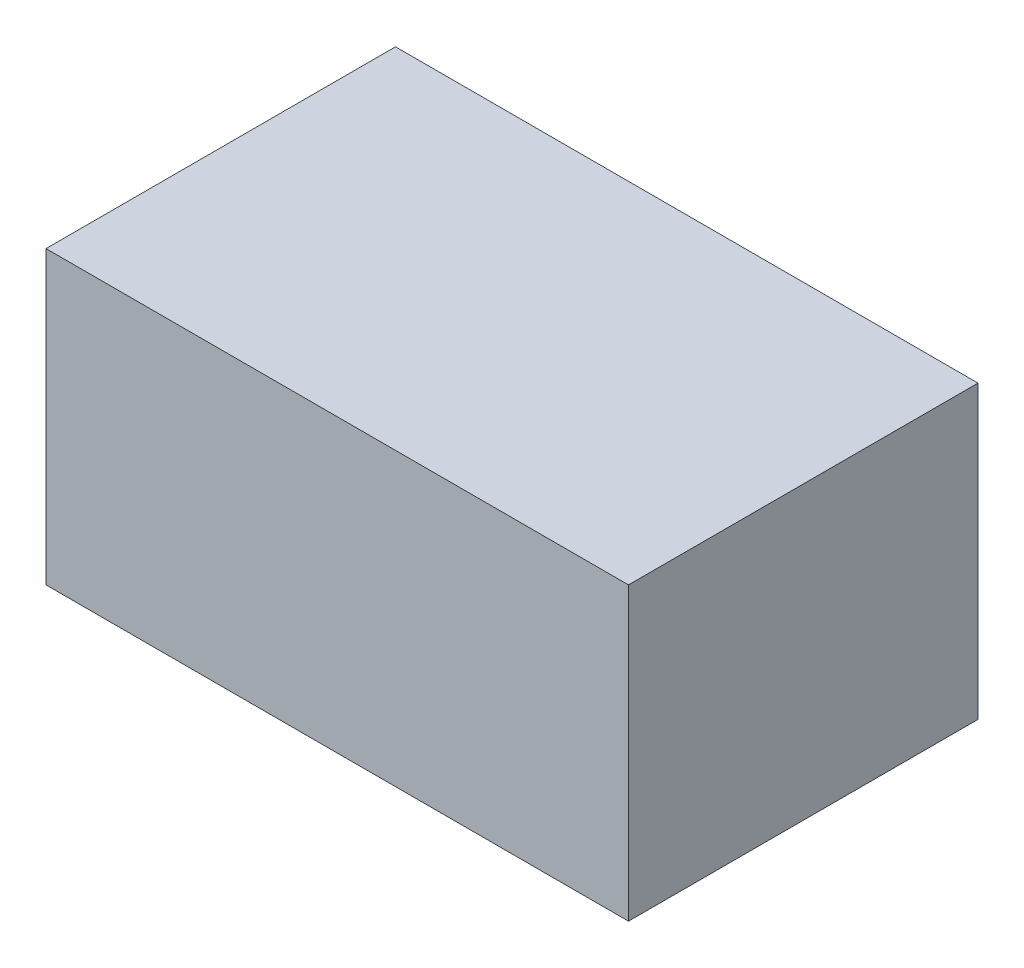
ISO-10303-21;
HEADER;
FILE_DESCRIPTION(('STEP AP214'),'2;1');
FILE_NAME('part.step','',(''),(''),'','','');
FILE_SCHEMA(('AUTOMOTIVE_DESIGN { 1 0 10303 214 1 1 1 1 }'));
ENDSEC;
DATA;
#1=APPLICATION_CONTEXT('core data for automotive mechanical design processes');
#2=APPLICATION_PROTOCOL_DEFINITION('international standard','automotive_design',2000,#1);
#3=PRODUCT_CONTEXT('',#1,'mechanical');
#4=PRODUCT('Part','Part','',(#3));
#5=PRODUCT_RELATED_PRODUCT_CATEGORY('part','',(#4));
#6=PRODUCT_DEFINITION_FORMATION('','',#4);
#7=PRODUCT_DEFINITION_CONTEXT('part definition',#1,'design');
#8=PRODUCT_DEFINITION('design','',#6,#7);
#9=PRODUCT_DEFINITION_SHAPE('','',#8);
#10=(LENGTH_UNIT() NAMED_UNIT(*) SI_UNIT(.MILLI.,.METRE.));
#11=(NAMED_UNIT(*) PLANE_ANGLE_UNIT() SI_UNIT($,.RADIAN.));
#12=(NAMED_UNIT(*) SI_UNIT($,.STERADIAN.) SOLID_ANGLE_UNIT());
#13=UNCERTAINTY_MEASURE_WITH_UNIT(LENGTH_MEASURE(1.E-05),#10,'distance_accuracy_value','');
#14=(GEOMETRIC_REPRESENTATION_CONTEXT(3) GLOBAL_UNCERTAINTY_ASSIGNED_CONTEXT((#13)) GLOBAL_UNIT_ASSIGNED_CONTEXT((#10,
#11,#12)) REPRESENTATION_CONTEXT('',''));
#15=CARTESIAN_POINT('',(0.,0.,0.));
#16=DIRECTION('',(0.,0.,1.));
#17=DIRECTION('',(1.,0.,0.));
#18=AXIS2_PLACEMENT_3D('',#15,#16,#17);
#19=CARTESIAN_POINT('',(0.,0.5,0.));
#20=DIRECTION('',(1.,0.,0.));
#21=DIRECTION('',(0.,0.,-1.));
#22=AXIS2_PLACEMENT_3D('',#19,#20,#21);
#23=PLANE('',#22);
#24=DIRECTION('',(0.,0.,1.));
#25=VECTOR('',#24,1.);
#26=CARTESIAN_POINT('',(0.,0.,0.));
#27=LINE('',#26,#25);
#28=CARTESIAN_POINT('',(0.,0.,-0.6));
#29=VERTEX_POINT('',#28);
#30=CARTESIAN_POINT('',(0.,0.,0.));
#31=VERTEX_POINT('',#30);
#32=EDGE_CURVE('E102',#29,#31,#27,.T.);
#33=ORIENTED_EDGE('',*,*,#32,.T.);
#34=DIRECTION('',(0.,-1.,0.));
#35=VECTOR('',#34,1.);
#36=CARTESIAN_POINT('',(0.,0.5,0.));
#37=LINE('',#36,#35);
#38=CARTESIAN_POINT('',(0.,0.5,0.));
#39=VERTEX_POINT('',#38);
#40=EDGE_CURVE('E11',#39,#31,#37,.T.);
#41=ORIENTED_EDGE('',*,*,#40,.F.);
#42=DIRECTION('',(0.,0.,1.));
#43=VECTOR('',#42,1.);
#44=CARTESIAN_POINT('',(0.,0.5,0.));
#45=LINE('',#44,#43);
#46=CARTESIAN_POINT('',(0.,0.5,-0.6));
#47=VERTEX_POINT('',#46);
#48=EDGE_CURVE('E90',#47,#39,#45,.T.);
#49=ORIENTED_EDGE('',*,*,#48,.F.);
#50=DIRECTION('',(0.,-1.,0.));
#51=VECTOR('',#50,1.);
#52=CARTESIAN_POINT('',(0.,0.5,-0.6));
#53=LINE('',#52,#51);
#54=EDGE_CURVE('E98',#47,#29,#53,.T.);
#55=ORIENTED_EDGE('',*,*,#54,.T.);
#56=EDGE_LOOP('',(#33,#41,#49,#55));
#57=FACE_BOUND('',#56,.T.);
#58=ADVANCED_FACE('F39',(#57),#23,.F.);
#59=CARTESIAN_POINT('',(0.,0.5,0.));
#60=DIRECTION('',(0.,0.,-1.));
#61=DIRECTION('',(-1.,0.,0.));
#62=AXIS2_PLACEMENT_3D('',#59,#60,#61);
#63=PLANE('',#62);
#64=DIRECTION('',(1.,0.,0.));
#65=VECTOR('',#64,1.);
#66=CARTESIAN_POINT('',(0.,0.,0.));
#67=LINE('',#66,#65);
#68=CARTESIAN_POINT('',(1.,0.,0.));
#69=VERTEX_POINT('',#68);
#70=EDGE_CURVE('E94',#31,#69,#67,.T.);
#71=ORIENTED_EDGE('',*,*,#70,.T.);
#72=DIRECTION('',(0.,-1.,0.));
#73=VECTOR('',#72,1.);
#74=CARTESIAN_POINT('',(1.,0.5,0.));
#75=LINE('',#74,#73);
#76=CARTESIAN_POINT('',(1.,0.5,0.));
#77=VERTEX_POINT('',#76);
#78=EDGE_CURVE('E47',#77,#69,#75,.T.);
#79=ORIENTED_EDGE('',*,*,#78,.F.);
#80=DIRECTION('',(1.,0.,0.));
#81=VECTOR('',#80,1.);
#82=CARTESIAN_POINT('',(0.,0.5,0.));
#83=LINE('',#82,#81);
#84=EDGE_CURVE('E85',#39,#77,#83,.T.);
#85=ORIENTED_EDGE('',*,*,#84,.F.);
#86=ORIENTED_EDGE('',*,*,#40,.T.);
#87=EDGE_LOOP('',(#71,#79,#85,#86));
#88=FACE_BOUND('',#87,.T.);
#89=ADVANCED_FACE('F93',(#88),#63,.F.);
#90=CARTESIAN_POINT('',(1.,0.5,0.));
#91=DIRECTION('',(-1.,0.,0.));
#92=DIRECTION('',(0.,0.,1.));
#93=AXIS2_PLACEMENT_3D('',#90,#91,#92);
#94=PLANE('',#93);
#95=DIRECTION('',(0.,0.,-1.));
#96=VECTOR('',#95,1.);
#97=CARTESIAN_POINT('',(1.,0.,0.));
#98=LINE('',#97,#96);
#99=CARTESIAN_POINT('',(1.,0.,-0.6));
#100=VERTEX_POINT('',#99);
#101=EDGE_CURVE('E72',#69,#100,#98,.T.);
#102=ORIENTED_EDGE('',*,*,#101,.T.);
#103=DIRECTION('',(0.,-1.,0.));
#104=VECTOR('',#103,1.);
#105=CARTESIAN_POINT('',(1.,0.5,-0.6));
#106=LINE('',#105,#104);
#107=CARTESIAN_POINT('',(1.,0.5,-0.6));
#108=VERTEX_POINT('',#107);
#109=EDGE_CURVE('E95',#108,#100,#106,.T.);
#110=ORIENTED_EDGE('',*,*,#109,.F.);
#111=DIRECTION('',(0.,0.,-1.));
#112=VECTOR('',#111,1.);
#113=CARTESIAN_POINT('',(1.,0.5,0.));
#114=LINE('',#113,#112);
#115=EDGE_CURVE('E88',#77,#108,#114,.T.);
#116=ORIENTED_EDGE('',*,*,#115,.F.);
#117=ORIENTED_EDGE('',*,*,#78,.T.);
#118=EDGE_LOOP('',(#102,#110,#116,#117));
#119=FACE_BOUND('',#118,.T.);
#120=ADVANCED_FACE('F96',(#119),#94,.F.);
#121=CARTESIAN_POINT('',(0.,0.5,-0.6));
#122=DIRECTION('',(0.,0.,1.));
#123=DIRECTION('',(1.,0.,0.));
#124=AXIS2_PLACEMENT_3D('',#121,#122,#123);
#125=PLANE('',#124);
#126=DIRECTION('',(-1.,0.,0.));
#127=VECTOR('',#126,1.);
#128=CARTESIAN_POINT('',(0.,0.,-0.6));
#129=LINE('',#128,#127);
#130=EDGE_CURVE('E78',#100,#29,#129,.T.);
#131=ORIENTED_EDGE('',*,*,#130,.T.);
#132=ORIENTED_EDGE('',*,*,#54,.F.);
#133=DIRECTION('',(-1.,0.,0.));
#134=VECTOR('',#133,1.);
#135=CARTESIAN_POINT('',(0.,0.5,-0.6));
#136=LINE('',#135,#134);
#137=EDGE_CURVE('E55',#108,#47,#136,.T.);
#138=ORIENTED_EDGE('',*,*,#137,.F.);
#139=ORIENTED_EDGE('',*,*,#109,.T.);
#140=EDGE_LOOP('',(#131,#132,#138,#139));
#141=FACE_BOUND('',#140,.T.);
#142=ADVANCED_FACE('F109',(#141),#125,.F.);
#143=CARTESIAN_POINT('',(0.,0.5,0.));
#144=DIRECTION('',(0.,-1.,0.));
#145=DIRECTION('',(0.,0.,-1.));
#146=AXIS2_PLACEMENT_3D('',#143,#144,#145);
#147=PLANE('',#146);
#148=ORIENTED_EDGE('',*,*,#48,.T.);
#149=ORIENTED_EDGE('',*,*,#84,.T.);
#150=ORIENTED_EDGE('',*,*,#115,.T.);
#151=ORIENTED_EDGE('',*,*,#137,.T.);
#152=EDGE_LOOP('',(#148,#149,#150,#151));
#153=FACE_BOUND('',#152,.T.);
#154=ADVANCED_FACE('F86',(#153),#147,.F.);
#155=CARTESIAN_POINT('',(0.,0.,0.));
#156=DIRECTION('',(0.,-1.,0.));
#157=DIRECTION('',(0.,0.,-1.));
#158=AXIS2_PLACEMENT_3D('',#155,#156,#157);
#159=PLANE('',#158);
#160=ORIENTED_EDGE('',*,*,#32,.F.);
#161=ORIENTED_EDGE('',*,*,#130,.F.);
#162=ORIENTED_EDGE('',*,*,#101,.F.);
#163=ORIENTED_EDGE('',*,*,#70,.F.);
#164=EDGE_LOOP('',(#160,#161,#162,#163));
#165=FACE_BOUND('',#164,.T.);
#166=ADVANCED_FACE('F112',(#165),#159,.T.);
#167=CLOSED_SHELL('',(#58,#89,#120,#142,#154,#166));
#168=MANIFOLD_SOLID_BREP('B2',#167);
#169=ADVANCED_BREP_SHAPE_REPRESENTATION('',(#18,#168),#14);
#170=SHAPE_DEFINITION_REPRESENTATION(#9,#169);
ENDSEC;
END-ISO-10303-21;
